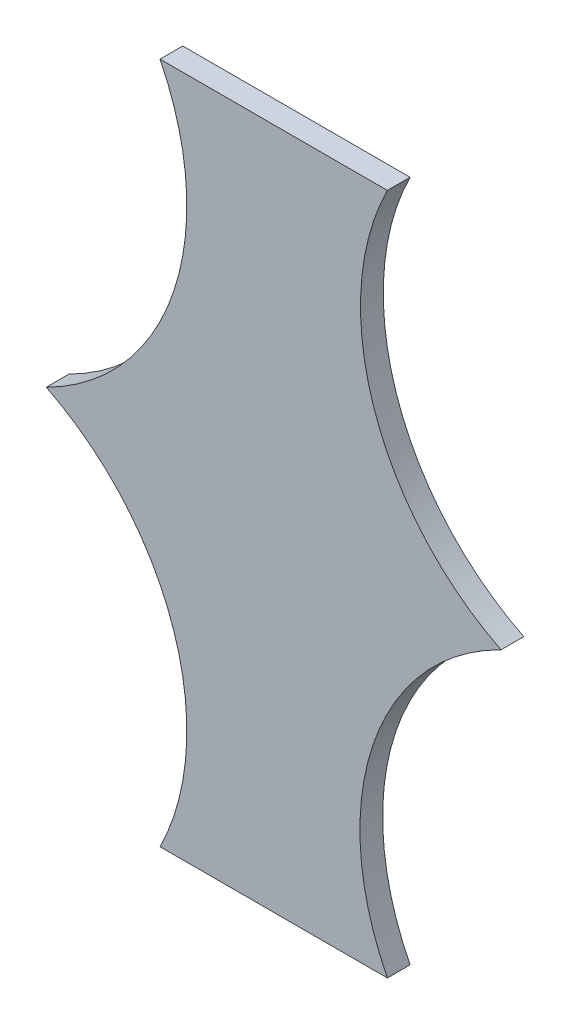
ISO-10303-21;
HEADER;
FILE_DESCRIPTION(('STEP AP214'),'2;1');
FILE_NAME('part.step','',(''),(''),'','','');
FILE_SCHEMA(('AUTOMOTIVE_DESIGN { 1 0 10303 214 1 1 1 1 }'));
ENDSEC;
DATA;
#1=APPLICATION_CONTEXT('core data for automotive mechanical design processes');
#2=APPLICATION_PROTOCOL_DEFINITION('international standard','automotive_design',2000,#1);
#3=PRODUCT_CONTEXT('',#1,'mechanical');
#4=PRODUCT('Part','Part','',(#3));
#5=PRODUCT_RELATED_PRODUCT_CATEGORY('part','',(#4));
#6=PRODUCT_DEFINITION_FORMATION('','',#4);
#7=PRODUCT_DEFINITION_CONTEXT('part definition',#1,'design');
#8=PRODUCT_DEFINITION('design','',#6,#7);
#9=PRODUCT_DEFINITION_SHAPE('','',#8);
#10=(LENGTH_UNIT() NAMED_UNIT(*) SI_UNIT(.MILLI.,.METRE.));
#11=(NAMED_UNIT(*) PLANE_ANGLE_UNIT() SI_UNIT($,.RADIAN.));
#12=(NAMED_UNIT(*) SI_UNIT($,.STERADIAN.) SOLID_ANGLE_UNIT());
#13=UNCERTAINTY_MEASURE_WITH_UNIT(LENGTH_MEASURE(1.E-05),#10,'distance_accuracy_value','');
#14=(GEOMETRIC_REPRESENTATION_CONTEXT(3) GLOBAL_UNCERTAINTY_ASSIGNED_CONTEXT((#13)) GLOBAL_UNIT_ASSIGNED_CONTEXT((#10,
#11,#12)) REPRESENTATION_CONTEXT('',''));
#15=CARTESIAN_POINT('',(0.,0.,0.));
#16=DIRECTION('',(0.,0.,1.));
#17=DIRECTION('',(1.,0.,0.));
#18=AXIS2_PLACEMENT_3D('',#15,#16,#17);
#19=CARTESIAN_POINT('',(97.8549916415646,-399.235470729692,20.));
#20=DIRECTION('',(0.,0.,-1.));
#21=DIRECTION('',(-1.,0.,0.));
#22=AXIS2_PLACEMENT_3D('',#19,#20,#21);
#23=CYLINDRICAL_SURFACE('',#22,221.969304603255);
#24=CARTESIAN_POINT('',(97.8549916415646,-399.235470729692,0.));
#25=DIRECTION('',(0.,0.,-1.));
#26=DIRECTION('',(-1.,0.,0.));
#27=AXIS2_PLACEMENT_3D('',#24,#25,#26);
#28=CIRCLE('',#27,221.969304603255);
#29=CARTESIAN_POINT('',(-99.9428392064633,-499.964762883799,0.));
#30=VERTEX_POINT('',#29);
#31=CARTESIAN_POINT('',(1.38777878078145E-13,-200.,0.));
#32=VERTEX_POINT('',#31);
#33=EDGE_CURVE('E137',#30,#32,#28,.T.);
#34=ORIENTED_EDGE('',*,*,#33,.T.);
#35=DIRECTION('',(0.,0.,-1.));
#36=VECTOR('',#35,1.);
#37=CARTESIAN_POINT('',(1.38777878078145E-13,-200.,20.));
#38=LINE('',#37,#36);
#39=CARTESIAN_POINT('',(1.38777878078145E-13,-200.,20.));
#40=VERTEX_POINT('',#39);
#41=EDGE_CURVE('E11',#40,#32,#38,.T.);
#42=ORIENTED_EDGE('',*,*,#41,.F.);
#43=CARTESIAN_POINT('',(97.8549916415646,-399.235470729692,20.));
#44=DIRECTION('',(0.,0.,-1.));
#45=DIRECTION('',(-1.,0.,0.));
#46=AXIS2_PLACEMENT_3D('',#43,#44,#45);
#47=CIRCLE('',#46,221.969304603255);
#48=CARTESIAN_POINT('',(-99.9428392064633,-499.964762883799,20.));
#49=VERTEX_POINT('',#48);
#50=EDGE_CURVE('E155',#49,#40,#47,.T.);
#51=ORIENTED_EDGE('',*,*,#50,.F.);
#52=DIRECTION('',(0.,0.,-1.));
#53=VECTOR('',#52,1.);
#54=CARTESIAN_POINT('',(-99.9428392064633,-499.964762883799,20.));
#55=LINE('',#54,#53);
#56=EDGE_CURVE('E64',#49,#30,#55,.T.);
#57=ORIENTED_EDGE('',*,*,#56,.T.);
#58=EDGE_LOOP('',(#34,#42,#51,#57));
#59=FACE_BOUND('',#58,.T.);
#60=ADVANCED_FACE('F47',(#59),#23,.F.);
#61=CARTESIAN_POINT('',(100.,-0.0352371162021456,20.));
#62=DIRECTION('',(0.,0.,-1.));
#63=DIRECTION('',(-1.,0.,0.));
#64=AXIS2_PLACEMENT_3D('',#61,#62,#63);
#65=CYLINDRICAL_SURFACE('',#64,223.575281270478);
#66=CARTESIAN_POINT('',(100.,-0.0352371162021456,0.));
#67=DIRECTION('',(0.,0.,-1.));
#68=DIRECTION('',(-1.,0.,0.));
#69=AXIS2_PLACEMENT_3D('',#66,#67,#68);
#70=CIRCLE('',#69,223.575281270478);
#71=CARTESIAN_POINT('',(-99.9647628837979,99.9647628837976,0.));
#72=VERTEX_POINT('',#71);
#73=EDGE_CURVE('E140',#32,#72,#70,.T.);
#74=ORIENTED_EDGE('',*,*,#73,.T.);
#75=DIRECTION('',(0.,0.,-1.));
#76=VECTOR('',#75,1.);
#77=CARTESIAN_POINT('',(-99.9647628837979,99.9647628837976,20.));
#78=LINE('',#77,#76);
#79=CARTESIAN_POINT('',(-99.9647628837979,99.9647628837976,20.));
#80=VERTEX_POINT('',#79);
#81=EDGE_CURVE('E56',#80,#72,#78,.T.);
#82=ORIENTED_EDGE('',*,*,#81,.F.);
#83=CARTESIAN_POINT('',(100.,-0.0352371162021456,20.));
#84=DIRECTION('',(0.,0.,-1.));
#85=DIRECTION('',(-1.,0.,0.));
#86=AXIS2_PLACEMENT_3D('',#83,#84,#85);
#87=CIRCLE('',#86,223.575281270478);
#88=EDGE_CURVE('E97',#40,#80,#87,.T.);
#89=ORIENTED_EDGE('',*,*,#88,.F.);
#90=ORIENTED_EDGE('',*,*,#41,.T.);
#91=EDGE_LOOP('',(#74,#82,#89,#90));
#92=FACE_BOUND('',#91,.T.);
#93=ADVANCED_FACE('F180',(#92),#65,.F.);
#94=CARTESIAN_POINT('',(-99.9647628837979,99.9647628837976,20.));
#95=DIRECTION('',(0.,-1.,0.));
#96=DIRECTION('',(0.,0.,-1.));
#97=AXIS2_PLACEMENT_3D('',#94,#95,#96);
#98=PLANE('',#97);
#99=DIRECTION('',(-1.,0.,0.));
#100=VECTOR('',#99,1.);
#101=CARTESIAN_POINT('',(-99.9647628837979,99.9647628837976,0.));
#102=LINE('',#101,#100);
#103=CARTESIAN_POINT('',(-299.914874032192,99.9647628837976,0.));
#104=VERTEX_POINT('',#103);
#105=EDGE_CURVE('E143',#72,#104,#102,.T.);
#106=ORIENTED_EDGE('',*,*,#105,.T.);
#107=DIRECTION('',(0.,0.,-1.));
#108=VECTOR('',#107,1.);
#109=CARTESIAN_POINT('',(-299.914874032192,99.9647628837976,20.));
#110=LINE('',#109,#108);
#111=CARTESIAN_POINT('',(-299.914874032192,99.9647628837976,20.));
#112=VERTEX_POINT('',#111);
#113=EDGE_CURVE('E127',#112,#104,#110,.T.);
#114=ORIENTED_EDGE('',*,*,#113,.F.);
#115=DIRECTION('',(-1.,0.,0.));
#116=VECTOR('',#115,1.);
#117=CARTESIAN_POINT('',(-99.9647628837979,99.9647628837976,20.));
#118=LINE('',#117,#116);
#119=EDGE_CURVE('E113',#80,#112,#118,.T.);
#120=ORIENTED_EDGE('',*,*,#119,.F.);
#121=ORIENTED_EDGE('',*,*,#81,.T.);
#122=EDGE_LOOP('',(#106,#114,#120,#121));
#123=FACE_BOUND('',#122,.T.);
#124=ADVANCED_FACE('F165',(#123),#98,.F.);
#125=CARTESIAN_POINT('',(-499.939818457995,0.0249444258029197,20.));
#126=DIRECTION('',(0.,0.,-1.));
#127=DIRECTION('',(-1.,0.,0.));
#128=AXIS2_PLACEMENT_3D('',#125,#126,#127);
#129=CYLINDRICAL_SURFACE('',#128,223.602204161682);
#130=CARTESIAN_POINT('',(-499.939818457995,0.0249444258029197,0.));
#131=DIRECTION('',(0.,0.,-1.));
#132=DIRECTION('',(-1.,0.,0.));
#133=AXIS2_PLACEMENT_3D('',#130,#131,#132);
#134=CIRCLE('',#133,223.602204161682);
#135=CARTESIAN_POINT('',(-400.,-200.,0.));
#136=VERTEX_POINT('',#135);
#137=EDGE_CURVE('E123',#104,#136,#134,.T.);
#138=ORIENTED_EDGE('',*,*,#137,.T.);
#139=DIRECTION('',(0.,0.,-1.));
#140=VECTOR('',#139,1.);
#141=CARTESIAN_POINT('',(-400.,-200.,20.));
#142=LINE('',#141,#140);
#143=CARTESIAN_POINT('',(-400.,-200.,20.));
#144=VERTEX_POINT('',#143);
#145=EDGE_CURVE('E120',#144,#136,#142,.T.);
#146=ORIENTED_EDGE('',*,*,#145,.F.);
#147=CARTESIAN_POINT('',(-499.939818457995,0.0249444258029197,20.));
#148=DIRECTION('',(0.,0.,-1.));
#149=DIRECTION('',(-1.,0.,0.));
#150=AXIS2_PLACEMENT_3D('',#147,#148,#149);
#151=CIRCLE('',#150,223.602204161682);
#152=EDGE_CURVE('E106',#112,#144,#151,.T.);
#153=ORIENTED_EDGE('',*,*,#152,.F.);
#154=ORIENTED_EDGE('',*,*,#113,.T.);
#155=EDGE_LOOP('',(#138,#146,#153,#154));
#156=FACE_BOUND('',#155,.T.);
#157=ADVANCED_FACE('F121',(#156),#129,.F.);
#158=CARTESIAN_POINT('',(-499.939818458012,-400.024944425809,20.));
#159=DIRECTION('',(0.,0.,-1.));
#160=DIRECTION('',(-1.,0.,0.));
#161=AXIS2_PLACEMENT_3D('',#158,#159,#160);
#162=CYLINDRICAL_SURFACE('',#161,223.602204161695);
#163=CARTESIAN_POINT('',(-499.939818458012,-400.024944425809,0.));
#164=DIRECTION('',(0.,0.,-1.));
#165=DIRECTION('',(-1.,0.,0.));
#166=AXIS2_PLACEMENT_3D('',#163,#164,#165);
#167=CIRCLE('',#166,223.602204161695);
#168=CARTESIAN_POINT('',(-299.914874032192,-499.964762883799,0.));
#169=VERTEX_POINT('',#168);
#170=EDGE_CURVE('E148',#136,#169,#167,.T.);
#171=ORIENTED_EDGE('',*,*,#170,.T.);
#172=DIRECTION('',(0.,0.,-1.));
#173=VECTOR('',#172,1.);
#174=CARTESIAN_POINT('',(-299.914874032192,-499.964762883799,20.));
#175=LINE('',#174,#173);
#176=CARTESIAN_POINT('',(-299.914874032192,-499.964762883799,20.));
#177=VERTEX_POINT('',#176);
#178=EDGE_CURVE('E85',#177,#169,#175,.T.);
#179=ORIENTED_EDGE('',*,*,#178,.F.);
#180=CARTESIAN_POINT('',(-499.939818458012,-400.024944425809,20.));
#181=DIRECTION('',(0.,0.,-1.));
#182=DIRECTION('',(-1.,0.,0.));
#183=AXIS2_PLACEMENT_3D('',#180,#181,#182);
#184=CIRCLE('',#183,223.602204161695);
#185=EDGE_CURVE('E111',#144,#177,#184,.T.);
#186=ORIENTED_EDGE('',*,*,#185,.F.);
#187=ORIENTED_EDGE('',*,*,#145,.T.);
#188=EDGE_LOOP('',(#171,#179,#186,#187));
#189=FACE_BOUND('',#188,.T.);
#190=ADVANCED_FACE('F129',(#189),#162,.F.);
#191=CARTESIAN_POINT('',(-99.9428392064633,-499.964762883799,20.));
#192=DIRECTION('',(0.,-1.,0.));
#193=DIRECTION('',(0.,0.,-1.));
#194=AXIS2_PLACEMENT_3D('',#191,#192,#193);
#195=PLANE('',#194);
#196=DIRECTION('',(-1.,0.,0.));
#197=VECTOR('',#196,1.);
#198=CARTESIAN_POINT('',(-99.9428392064633,-499.964762883799,0.));
#199=LINE('',#198,#197);
#200=EDGE_CURVE('E151',#30,#169,#199,.T.);
#201=ORIENTED_EDGE('',*,*,#200,.F.);
#202=ORIENTED_EDGE('',*,*,#56,.F.);
#203=DIRECTION('',(-1.,0.,0.));
#204=VECTOR('',#203,1.);
#205=CARTESIAN_POINT('',(-99.9428392064633,-499.964762883799,20.));
#206=LINE('',#205,#204);
#207=EDGE_CURVE('E131',#49,#177,#206,.T.);
#208=ORIENTED_EDGE('',*,*,#207,.T.);
#209=ORIENTED_EDGE('',*,*,#178,.T.);
#210=EDGE_LOOP('',(#201,#202,#208,#209));
#211=FACE_BOUND('',#210,.T.);
#212=ADVANCED_FACE('F168',(#211),#195,.T.);
#213=CARTESIAN_POINT('',(97.8549916415646,-399.235470729692,20.));
#214=DIRECTION('',(0.,0.,-1.));
#215=DIRECTION('',(-1.,0.,0.));
#216=AXIS2_PLACEMENT_3D('',#213,#214,#215);
#217=PLANE('',#216);
#218=ORIENTED_EDGE('',*,*,#50,.T.);
#219=ORIENTED_EDGE('',*,*,#88,.T.);
#220=ORIENTED_EDGE('',*,*,#119,.T.);
#221=ORIENTED_EDGE('',*,*,#152,.T.);
#222=ORIENTED_EDGE('',*,*,#185,.T.);
#223=ORIENTED_EDGE('',*,*,#207,.F.);
#224=EDGE_LOOP('',(#218,#219,#220,#221,#222,#223));
#225=FACE_BOUND('',#224,.T.);
#226=ADVANCED_FACE('F108',(#225),#217,.F.);
#227=CARTESIAN_POINT('',(97.8549916415646,-399.235470729692,0.));
#228=DIRECTION('',(0.,0.,-1.));
#229=DIRECTION('',(-1.,0.,0.));
#230=AXIS2_PLACEMENT_3D('',#227,#228,#229);
#231=PLANE('',#230);
#232=ORIENTED_EDGE('',*,*,#33,.F.);
#233=ORIENTED_EDGE('',*,*,#200,.T.);
#234=ORIENTED_EDGE('',*,*,#170,.F.);
#235=ORIENTED_EDGE('',*,*,#137,.F.);
#236=ORIENTED_EDGE('',*,*,#105,.F.);
#237=ORIENTED_EDGE('',*,*,#73,.F.);
#238=EDGE_LOOP('',(#232,#233,#234,#235,#236,#237));
#239=FACE_BOUND('',#238,.T.);
#240=ADVANCED_FACE('F167',(#239),#231,.T.);
#241=CLOSED_SHELL('',(#60,#93,#124,#157,#190,#212,#226,#240));
#242=MANIFOLD_SOLID_BREP('B2',#241);
#243=ADVANCED_BREP_SHAPE_REPRESENTATION('',(#18,#242),#14);
#244=SHAPE_DEFINITION_REPRESENTATION(#9,#243);
ENDSEC;
END-ISO-10303-21;
